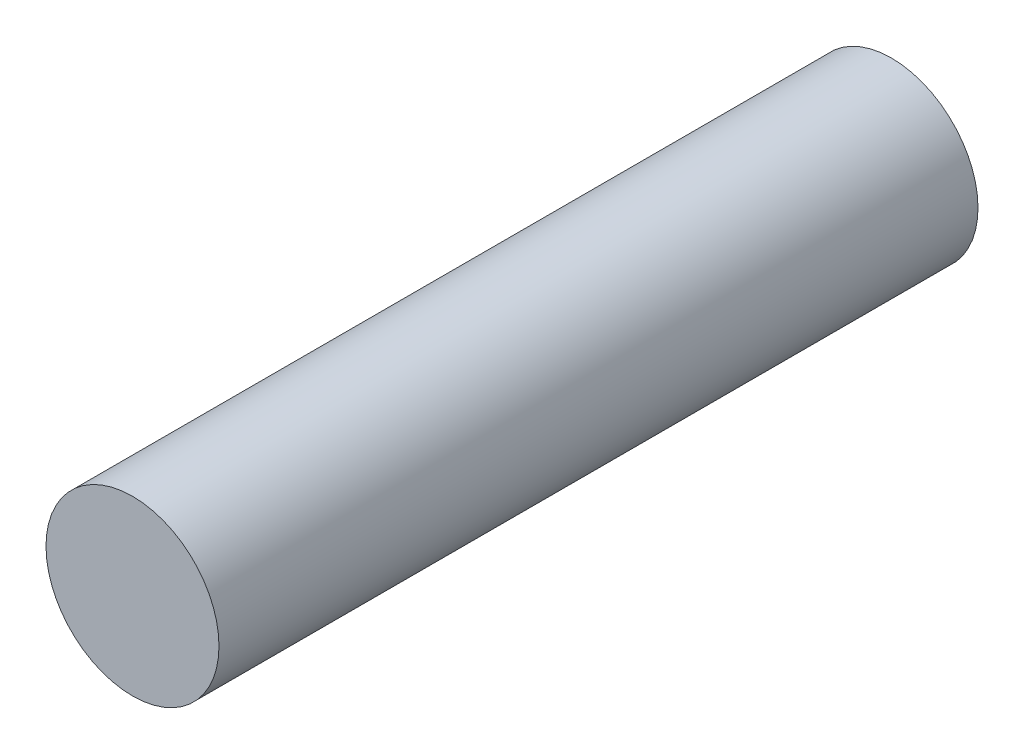
ISO-10303-21;
HEADER;
FILE_DESCRIPTION(('STEP AP214'),'2;1');
FILE_NAME('part.step','',(''),(''),'','','');
FILE_SCHEMA(('AUTOMOTIVE_DESIGN { 1 0 10303 214 1 1 1 1 }'));
ENDSEC;
DATA;
#1=APPLICATION_CONTEXT('core data for automotive mechanical design processes');
#2=APPLICATION_PROTOCOL_DEFINITION('international standard','automotive_design',2000,#1);
#3=PRODUCT_CONTEXT('',#1,'mechanical');
#4=PRODUCT('Part','Part','',(#3));
#5=PRODUCT_RELATED_PRODUCT_CATEGORY('part','',(#4));
#6=PRODUCT_DEFINITION_FORMATION('','',#4);
#7=PRODUCT_DEFINITION_CONTEXT('part definition',#1,'design');
#8=PRODUCT_DEFINITION('design','',#6,#7);
#9=PRODUCT_DEFINITION_SHAPE('','',#8);
#10=(LENGTH_UNIT() NAMED_UNIT(*) SI_UNIT(.MILLI.,.METRE.));
#11=(NAMED_UNIT(*) PLANE_ANGLE_UNIT() SI_UNIT($,.RADIAN.));
#12=(NAMED_UNIT(*) SI_UNIT($,.STERADIAN.) SOLID_ANGLE_UNIT());
#13=UNCERTAINTY_MEASURE_WITH_UNIT(LENGTH_MEASURE(1.E-05),#10,'distance_accuracy_value','');
#14=(GEOMETRIC_REPRESENTATION_CONTEXT(3) GLOBAL_UNCERTAINTY_ASSIGNED_CONTEXT((#13)) GLOBAL_UNIT_ASSIGNED_CONTEXT((#10,
#11,#12)) REPRESENTATION_CONTEXT('',''));
#15=CARTESIAN_POINT('',(0.,0.,0.));
#16=DIRECTION('',(0.,0.,1.));
#17=DIRECTION('',(1.,0.,0.));
#18=AXIS2_PLACEMENT_3D('',#15,#16,#17);
#19=CARTESIAN_POINT('',(0.,0.,15.795));
#20=DIRECTION('',(0.,0.,-1.));
#21=DIRECTION('',(-1.,0.,0.));
#22=AXIS2_PLACEMENT_3D('',#19,#20,#21);
#23=CYLINDRICAL_SURFACE('',#22,2.4);
#24=CARTESIAN_POINT('',(0.,0.,15.795));
#25=DIRECTION('',(0.,0.,1.));
#26=DIRECTION('',(1.,0.,0.));
#27=AXIS2_PLACEMENT_3D('',#24,#25,#26);
#28=CIRCLE('',#27,2.4);
#29=CARTESIAN_POINT('',(2.4,0.,15.795));
#30=VERTEX_POINT('',#29);
#31=EDGE_CURVE('E10',#30,#30,#28,.T.);
#32=ORIENTED_EDGE('',*,*,#31,.F.);
#33=EDGE_LOOP('',(#32));
#34=FACE_BOUND('',#33,.T.);
#35=CARTESIAN_POINT('',(0.,0.,-5.265));
#36=DIRECTION('',(0.,0.,1.));
#37=DIRECTION('',(1.,0.,0.));
#38=AXIS2_PLACEMENT_3D('',#35,#36,#37);
#39=CIRCLE('',#38,2.4);
#40=CARTESIAN_POINT('',(2.4,0.,-5.265));
#41=VERTEX_POINT('',#40);
#42=EDGE_CURVE('E36',#41,#41,#39,.T.);
#43=ORIENTED_EDGE('',*,*,#42,.T.);
#44=EDGE_LOOP('',(#43));
#45=FACE_BOUND('',#44,.T.);
#46=ADVANCED_FACE('F33',(#34,#45),#23,.T.);
#47=CARTESIAN_POINT('',(0.,0.,15.795));
#48=DIRECTION('',(0.,0.,1.));
#49=DIRECTION('',(1.,0.,0.));
#50=AXIS2_PLACEMENT_3D('',#47,#48,#49);
#51=PLANE('',#50);
#52=ORIENTED_EDGE('',*,*,#31,.T.);
#53=EDGE_LOOP('',(#52));
#54=FACE_BOUND('',#53,.T.);
#55=ADVANCED_FACE('F48',(#54),#51,.T.);
#56=CARTESIAN_POINT('',(0.,0.,-5.265));
#57=DIRECTION('',(0.,0.,1.));
#58=DIRECTION('',(1.,0.,0.));
#59=AXIS2_PLACEMENT_3D('',#56,#57,#58);
#60=PLANE('',#59);
#61=ORIENTED_EDGE('',*,*,#42,.F.);
#62=EDGE_LOOP('',(#61));
#63=FACE_BOUND('',#62,.T.);
#64=ADVANCED_FACE('F46',(#63),#60,.F.);
#65=CLOSED_SHELL('',(#46,#55,#64));
#66=MANIFOLD_SOLID_BREP('B2',#65);
#67=ADVANCED_BREP_SHAPE_REPRESENTATION('',(#18,#66),#14);
#68=SHAPE_DEFINITION_REPRESENTATION(#9,#67);
ENDSEC;
END-ISO-10303-21;
